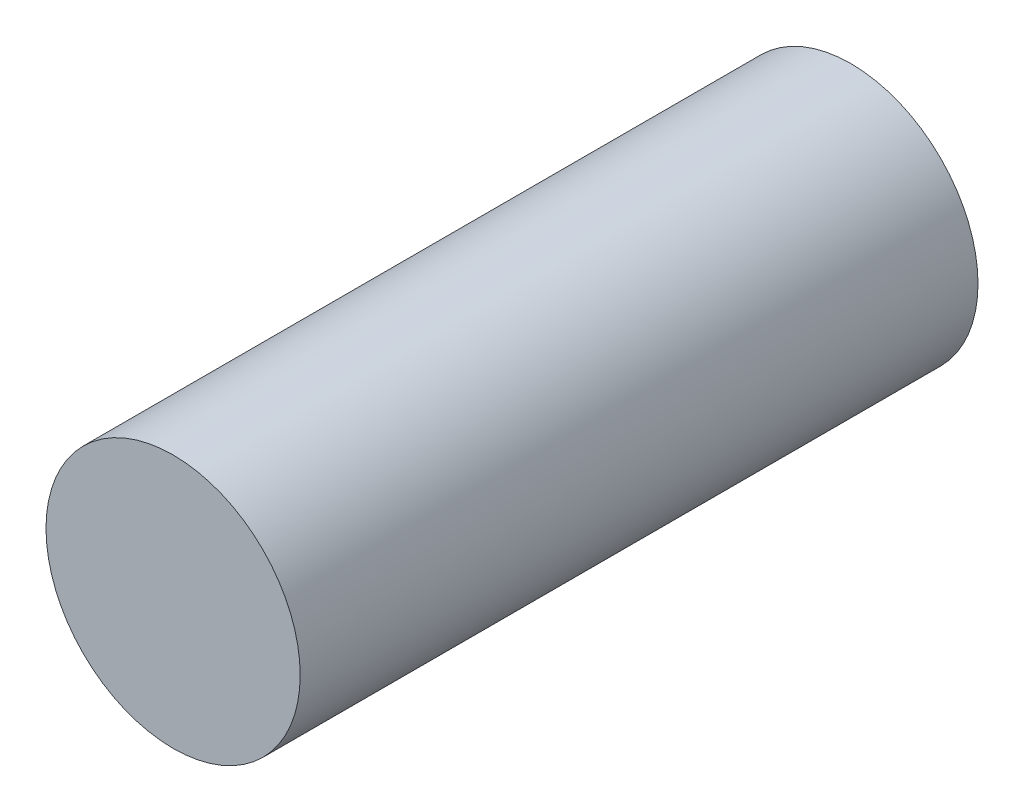
ISO-10303-21;
HEADER;
FILE_DESCRIPTION(('STEP AP214'),'2;1');
FILE_NAME('part.step','',(''),(''),'','','');
FILE_SCHEMA(('AUTOMOTIVE_DESIGN { 1 0 10303 214 1 1 1 1 }'));
ENDSEC;
DATA;
#1=APPLICATION_CONTEXT('core data for automotive mechanical design processes');
#2=APPLICATION_PROTOCOL_DEFINITION('international standard','automotive_design',2000,#1);
#3=PRODUCT_CONTEXT('',#1,'mechanical');
#4=PRODUCT('Part','Part','',(#3));
#5=PRODUCT_RELATED_PRODUCT_CATEGORY('part','',(#4));
#6=PRODUCT_DEFINITION_FORMATION('','',#4);
#7=PRODUCT_DEFINITION_CONTEXT('part definition',#1,'design');
#8=PRODUCT_DEFINITION('design','',#6,#7);
#9=PRODUCT_DEFINITION_SHAPE('','',#8);
#10=(LENGTH_UNIT() NAMED_UNIT(*) SI_UNIT(.MILLI.,.METRE.));
#11=(NAMED_UNIT(*) PLANE_ANGLE_UNIT() SI_UNIT($,.RADIAN.));
#12=(NAMED_UNIT(*) SI_UNIT($,.STERADIAN.) SOLID_ANGLE_UNIT());
#13=UNCERTAINTY_MEASURE_WITH_UNIT(LENGTH_MEASURE(1.E-05),#10,'distance_accuracy_value','');
#14=(GEOMETRIC_REPRESENTATION_CONTEXT(3) GLOBAL_UNCERTAINTY_ASSIGNED_CONTEXT((#13)) GLOBAL_UNIT_ASSIGNED_CONTEXT((#10,
#11,#12)) REPRESENTATION_CONTEXT('',''));
#15=CARTESIAN_POINT('',(0.,0.,0.));
#16=DIRECTION('',(0.,0.,1.));
#17=DIRECTION('',(1.,0.,0.));
#18=AXIS2_PLACEMENT_3D('',#15,#16,#17);
#19=CARTESIAN_POINT('',(0.,0.,25.4));
#20=DIRECTION('',(0.,0.,-1.));
#21=DIRECTION('',(-1.,0.,0.));
#22=AXIS2_PLACEMENT_3D('',#19,#20,#21);
#23=CYLINDRICAL_SURFACE('',#22,4.7625);
#24=CARTESIAN_POINT('',(0.,0.,25.4));
#25=DIRECTION('',(0.,0.,1.));
#26=DIRECTION('',(1.,0.,0.));
#27=AXIS2_PLACEMENT_3D('',#24,#25,#26);
#28=CIRCLE('',#27,4.7625);
#29=CARTESIAN_POINT('',(4.7625,0.,25.4));
#30=VERTEX_POINT('',#29);
#31=EDGE_CURVE('E10',#30,#30,#28,.T.);
#32=ORIENTED_EDGE('',*,*,#31,.F.);
#33=EDGE_LOOP('',(#32));
#34=FACE_BOUND('',#33,.T.);
#35=CARTESIAN_POINT('',(0.,0.,0.));
#36=DIRECTION('',(0.,0.,1.));
#37=DIRECTION('',(1.,0.,0.));
#38=AXIS2_PLACEMENT_3D('',#35,#36,#37);
#39=CIRCLE('',#38,4.7625);
#40=CARTESIAN_POINT('',(4.7625,0.,0.));
#41=VERTEX_POINT('',#40);
#42=EDGE_CURVE('E36',#41,#41,#39,.T.);
#43=ORIENTED_EDGE('',*,*,#42,.T.);
#44=EDGE_LOOP('',(#43));
#45=FACE_BOUND('',#44,.T.);
#46=ADVANCED_FACE('F33',(#34,#45),#23,.T.);
#47=CARTESIAN_POINT('',(0.,0.,25.4));
#48=DIRECTION('',(0.,0.,1.));
#49=DIRECTION('',(1.,0.,0.));
#50=AXIS2_PLACEMENT_3D('',#47,#48,#49);
#51=PLANE('',#50);
#52=ORIENTED_EDGE('',*,*,#31,.T.);
#53=EDGE_LOOP('',(#52));
#54=FACE_BOUND('',#53,.T.);
#55=ADVANCED_FACE('F48',(#54),#51,.T.);
#56=CARTESIAN_POINT('',(0.,0.,0.));
#57=DIRECTION('',(0.,0.,1.));
#58=DIRECTION('',(1.,0.,0.));
#59=AXIS2_PLACEMENT_3D('',#56,#57,#58);
#60=PLANE('',#59);
#61=ORIENTED_EDGE('',*,*,#42,.F.);
#62=EDGE_LOOP('',(#61));
#63=FACE_BOUND('',#62,.T.);
#64=ADVANCED_FACE('F46',(#63),#60,.F.);
#65=CLOSED_SHELL('',(#46,#55,#64));
#66=MANIFOLD_SOLID_BREP('B2',#65);
#67=ADVANCED_BREP_SHAPE_REPRESENTATION('',(#18,#66),#14);
#68=SHAPE_DEFINITION_REPRESENTATION(#9,#67);
ENDSEC;
END-ISO-10303-21;
